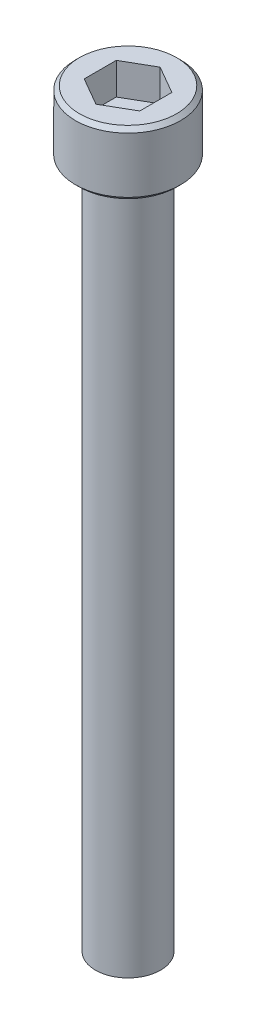
ISO-10303-21;
HEADER;
FILE_DESCRIPTION(('STEP AP214'),'2;1');
FILE_NAME('part.step','',(''),(''),'','','');
FILE_SCHEMA(('AUTOMOTIVE_DESIGN { 1 0 10303 214 1 1 1 1 }'));
ENDSEC;
DATA;
#1=APPLICATION_CONTEXT('core data for automotive mechanical design processes');
#2=APPLICATION_PROTOCOL_DEFINITION('international standard','automotive_design',2000,#1);
#3=PRODUCT_CONTEXT('',#1,'mechanical');
#4=PRODUCT('Part','Part','',(#3));
#5=PRODUCT_RELATED_PRODUCT_CATEGORY('part','',(#4));
#6=PRODUCT_DEFINITION_FORMATION('','',#4);
#7=PRODUCT_DEFINITION_CONTEXT('part definition',#1,'design');
#8=PRODUCT_DEFINITION('design','',#6,#7);
#9=PRODUCT_DEFINITION_SHAPE('','',#8);
#10=(LENGTH_UNIT() NAMED_UNIT(*) SI_UNIT(.MILLI.,.METRE.));
#11=(NAMED_UNIT(*) PLANE_ANGLE_UNIT() SI_UNIT($,.RADIAN.));
#12=(NAMED_UNIT(*) SI_UNIT($,.STERADIAN.) SOLID_ANGLE_UNIT());
#13=UNCERTAINTY_MEASURE_WITH_UNIT(LENGTH_MEASURE(1.E-05),#10,'distance_accuracy_value','');
#14=(GEOMETRIC_REPRESENTATION_CONTEXT(3) GLOBAL_UNCERTAINTY_ASSIGNED_CONTEXT((#13)) GLOBAL_UNIT_ASSIGNED_CONTEXT((#10,
#11,#12)) REPRESENTATION_CONTEXT('',''));
#15=CARTESIAN_POINT('',(0.,0.,0.));
#16=DIRECTION('',(0.,0.,1.));
#17=DIRECTION('',(1.,0.,0.));
#18=AXIS2_PLACEMENT_3D('',#15,#16,#17);
#19=CARTESIAN_POINT('',(0.,4.064,0.));
#20=DIRECTION('',(0.,-1.,0.));
#21=DIRECTION('',(1.,0.,0.));
#22=AXIS2_PLACEMENT_3D('',#19,#20,#21);
#23=CYLINDRICAL_SURFACE('',#22,3.3655);
#24=CARTESIAN_POINT('',(0.,3.80999999990233,0.));
#25=DIRECTION('',(0.,1.,0.));
#26=DIRECTION('',(-1.,0.,0.));
#27=AXIS2_PLACEMENT_3D('',#24,#25,#26);
#28=CIRCLE('',#27,3.3655);
#29=CARTESIAN_POINT('',(-3.3655,3.80999999990233,0.));
#30=VERTEX_POINT('',#29);
#31=EDGE_CURVE('E154',#30,#30,#28,.F.);
#32=ORIENTED_EDGE('',*,*,#31,.T.);
#33=EDGE_LOOP('',(#32));
#34=FACE_BOUND('',#33,.T.);
#35=CARTESIAN_POINT('',(0.,0.254000000097677,0.));
#36=DIRECTION('',(0.,-1.,0.));
#37=DIRECTION('',(1.,0.,0.));
#38=AXIS2_PLACEMENT_3D('',#35,#36,#37);
#39=CIRCLE('',#38,3.3655);
#40=CARTESIAN_POINT('',(3.3655,0.254000000097677,0.));
#41=VERTEX_POINT('',#40);
#42=EDGE_CURVE('E151',#41,#41,#39,.F.);
#43=ORIENTED_EDGE('',*,*,#42,.T.);
#44=EDGE_LOOP('',(#43));
#45=FACE_BOUND('',#44,.T.);
#46=ADVANCED_FACE('F40',(#34,#45),#23,.T.);
#47=CARTESIAN_POINT('',(3.3655,4.064,0.));
#48=DIRECTION('',(0.,1.,0.));
#49=DIRECTION('',(-1.,0.,0.));
#50=AXIS2_PLACEMENT_3D('',#47,#48,#49);
#51=PLANE('',#50);
#52=CARTESIAN_POINT('',(0.,4.064,0.));
#53=DIRECTION('',(0.,1.,0.));
#54=DIRECTION('',(-1.,0.,0.));
#55=AXIS2_PLACEMENT_3D('',#52,#53,#54);
#56=CIRCLE('',#55,3.11149999990232);
#57=CARTESIAN_POINT('',(-3.11149999990232,4.064,0.));
#58=VERTEX_POINT('',#57);
#59=EDGE_CURVE('E157',#58,#58,#56,.T.);
#60=ORIENTED_EDGE('',*,*,#59,.T.);
#61=EDGE_LOOP('',(#60));
#62=FACE_BOUND('',#61,.T.);
#63=DIRECTION('',(0.,0.,-1.));
#64=VECTOR('',#63,1.);
#65=CARTESIAN_POINT('',(1.77800000000001,4.064,1.02652877861916));
#66=LINE('',#65,#64);
#67=CARTESIAN_POINT('',(1.77800000000001,4.064,1.02652877861916));
#68=VERTEX_POINT('',#67);
#69=CARTESIAN_POINT('',(1.77800000000001,4.064,-1.02652877861913));
#70=VERTEX_POINT('',#69);
#71=EDGE_CURVE('E56',#68,#70,#66,.T.);
#72=ORIENTED_EDGE('',*,*,#71,.F.);
#73=DIRECTION('',(0.866025403784437,0.,-0.500000000000003));
#74=VECTOR('',#73,1.);
#75=CARTESIAN_POINT('',(0.,4.064,2.05305755723832));
#76=LINE('',#75,#74);
#77=CARTESIAN_POINT('',(0.,4.064,2.05305755723832));
#78=VERTEX_POINT('',#77);
#79=EDGE_CURVE('E139',#78,#68,#76,.T.);
#80=ORIENTED_EDGE('',*,*,#79,.F.);
#81=DIRECTION('',(0.866025403784441,0.,0.499999999999996));
#82=VECTOR('',#81,1.);
#83=CARTESIAN_POINT('',(-1.77799999999999,4.064,1.02652877861917));
#84=LINE('',#83,#82);
#85=CARTESIAN_POINT('',(-1.77799999999999,4.064,1.02652877861917));
#86=VERTEX_POINT('',#85);
#87=EDGE_CURVE('E137',#86,#78,#84,.T.);
#88=ORIENTED_EDGE('',*,*,#87,.F.);
#89=DIRECTION('',(0.,0.,1.));
#90=VECTOR('',#89,1.);
#91=CARTESIAN_POINT('',(-1.778,4.064,-1.02652877861914));
#92=LINE('',#91,#90);
#93=CARTESIAN_POINT('',(-1.778,4.064,-1.02652877861914));
#94=VERTEX_POINT('',#93);
#95=EDGE_CURVE('E104',#94,#86,#92,.T.);
#96=ORIENTED_EDGE('',*,*,#95,.F.);
#97=DIRECTION('',(-0.866025403784436,0.,0.500000000000004));
#98=VECTOR('',#97,1.);
#99=CARTESIAN_POINT('',(0.,4.064,-2.05305755723831));
#100=LINE('',#99,#98);
#101=CARTESIAN_POINT('',(0.,4.064,-2.05305755723831));
#102=VERTEX_POINT('',#101);
#103=EDGE_CURVE('E133',#102,#94,#100,.T.);
#104=ORIENTED_EDGE('',*,*,#103,.F.);
#105=DIRECTION('',(-0.866025403784434,0.,-0.500000000000008));
#106=VECTOR('',#105,1.);
#107=CARTESIAN_POINT('',(1.77800000000001,4.064,-1.02652877861913));
#108=LINE('',#107,#106);
#109=EDGE_CURVE('E130',#70,#102,#108,.T.);
#110=ORIENTED_EDGE('',*,*,#109,.F.);
#111=EDGE_LOOP('',(#72,#80,#88,#96,#104,#110));
#112=FACE_BOUND('',#111,.T.);
#113=ADVANCED_FACE('F177',(#62,#112),#51,.T.);
#114=CARTESIAN_POINT('',(0.,0.,0.));
#115=DIRECTION('',(0.,-1.,0.));
#116=DIRECTION('',(1.,0.,0.));
#117=AXIS2_PLACEMENT_3D('',#114,#115,#116);
#118=PLANE('',#117);
#119=CARTESIAN_POINT('',(0.,0.,0.));
#120=DIRECTION('',(0.,-1.,0.));
#121=DIRECTION('',(1.,0.,0.));
#122=AXIS2_PLACEMENT_3D('',#119,#120,#121);
#123=CIRCLE('',#122,3.11149999990232);
#124=CARTESIAN_POINT('',(3.11149999990232,0.,0.));
#125=VERTEX_POINT('',#124);
#126=EDGE_CURVE('E160',#125,#125,#123,.T.);
#127=ORIENTED_EDGE('',*,*,#126,.T.);
#128=EDGE_LOOP('',(#127));
#129=FACE_BOUND('',#128,.T.);
#130=CARTESIAN_POINT('',(0.,0.,0.));
#131=DIRECTION('',(0.,-1.,0.));
#132=DIRECTION('',(1.,0.,0.));
#133=AXIS2_PLACEMENT_3D('',#130,#131,#132);
#134=CIRCLE('',#133,2.0828);
#135=CARTESIAN_POINT('',(2.0828,0.,0.));
#136=VERTEX_POINT('',#135);
#137=EDGE_CURVE('E143',#136,#136,#134,.T.);
#138=ORIENTED_EDGE('',*,*,#137,.F.);
#139=EDGE_LOOP('',(#138));
#140=FACE_BOUND('',#139,.T.);
#141=ADVANCED_FACE('F183',(#129,#140),#118,.T.);
#142=CARTESIAN_POINT('',(0.,-44.45,0.));
#143=DIRECTION('',(0.,1.,0.));
#144=DIRECTION('',(-1.,0.,0.));
#145=AXIS2_PLACEMENT_3D('',#142,#143,#144);
#146=CYLINDRICAL_SURFACE('',#145,2.0828);
#147=CARTESIAN_POINT('',(0.,-43.9115200000046,0.));
#148=DIRECTION('',(0.,-1.,0.));
#149=DIRECTION('',(1.,0.,0.));
#150=AXIS2_PLACEMENT_3D('',#147,#148,#149);
#151=CIRCLE('',#150,2.0828);
#152=CARTESIAN_POINT('',(2.0828,-43.9115200000046,0.));
#153=VERTEX_POINT('',#152);
#154=EDGE_CURVE('E11',#153,#153,#151,.F.);
#155=ORIENTED_EDGE('',*,*,#154,.T.);
#156=EDGE_LOOP('',(#155));
#157=FACE_BOUND('',#156,.T.);
#158=ORIENTED_EDGE('',*,*,#137,.T.);
#159=EDGE_LOOP('',(#158));
#160=FACE_BOUND('',#159,.T.);
#161=ADVANCED_FACE('F222',(#157,#160),#146,.T.);
#162=CARTESIAN_POINT('',(0.,-44.45,0.));
#163=DIRECTION('',(0.,-1.,0.));
#164=DIRECTION('',(1.,0.,0.));
#165=AXIS2_PLACEMENT_3D('',#162,#163,#164);
#166=PLANE('',#165);
#167=CARTESIAN_POINT('',(0.,-44.45,0.));
#168=DIRECTION('',(0.,-1.,0.));
#169=DIRECTION('',(1.,0.,0.));
#170=AXIS2_PLACEMENT_3D('',#167,#168,#169);
#171=CIRCLE('',#170,1.31318000001919);
#172=CARTESIAN_POINT('',(1.31318000001919,-44.45,0.));
#173=VERTEX_POINT('',#172);
#174=EDGE_CURVE('E49',#173,#173,#171,.T.);
#175=ORIENTED_EDGE('',*,*,#174,.T.);
#176=EDGE_LOOP('',(#175));
#177=FACE_BOUND('',#176,.T.);
#178=ADVANCED_FACE('F165',(#177),#166,.T.);
#179=CARTESIAN_POINT('',(1.77800000000001,2.032,1.02652877861916));
#180=DIRECTION('',(1.,0.,0.));
#181=DIRECTION('',(0.,0.,-1.));
#182=AXIS2_PLACEMENT_3D('',#179,#180,#181);
#183=PLANE('',#182);
#184=ORIENTED_EDGE('',*,*,#71,.T.);
#185=DIRECTION('',(0.,1.,0.));
#186=VECTOR('',#185,1.);
#187=CARTESIAN_POINT('',(1.77800000000001,2.032,-1.02652877861913));
#188=LINE('',#187,#186);
#189=CARTESIAN_POINT('',(1.77800000000001,2.032,-1.02652877861913));
#190=VERTEX_POINT('',#189);
#191=EDGE_CURVE('E86',#190,#70,#188,.T.);
#192=ORIENTED_EDGE('',*,*,#191,.F.);
#193=DIRECTION('',(0.,0.,-1.));
#194=VECTOR('',#193,1.);
#195=CARTESIAN_POINT('',(1.77800000000001,2.032,1.02652877861916));
#196=LINE('',#195,#194);
#197=CARTESIAN_POINT('',(1.77800000000001,2.032,1.02652877861916));
#198=VERTEX_POINT('',#197);
#199=EDGE_CURVE('E141',#198,#190,#196,.T.);
#200=ORIENTED_EDGE('',*,*,#199,.F.);
#201=DIRECTION('',(0.,1.,0.));
#202=VECTOR('',#201,1.);
#203=CARTESIAN_POINT('',(1.77800000000001,2.032,1.02652877861916));
#204=LINE('',#203,#202);
#205=EDGE_CURVE('E64',#198,#68,#204,.T.);
#206=ORIENTED_EDGE('',*,*,#205,.T.);
#207=EDGE_LOOP('',(#184,#192,#200,#206));
#208=FACE_BOUND('',#207,.T.);
#209=ADVANCED_FACE('F213',(#208),#183,.F.);
#210=CARTESIAN_POINT('',(0.,2.032,2.05305755723832));
#211=DIRECTION('',(0.500000000000003,0.,0.866025403784437));
#212=DIRECTION('',(0.866025403784437,0.,-0.500000000000003));
#213=AXIS2_PLACEMENT_3D('',#210,#211,#212);
#214=PLANE('',#213);
#215=ORIENTED_EDGE('',*,*,#79,.T.);
#216=ORIENTED_EDGE('',*,*,#205,.F.);
#217=DIRECTION('',(0.866025403784437,0.,-0.500000000000003));
#218=VECTOR('',#217,1.);
#219=CARTESIAN_POINT('',(0.,2.032,2.05305755723832));
#220=LINE('',#219,#218);
#221=CARTESIAN_POINT('',(0.,2.032,2.05305755723832));
#222=VERTEX_POINT('',#221);
#223=EDGE_CURVE('E116',#222,#198,#220,.T.);
#224=ORIENTED_EDGE('',*,*,#223,.F.);
#225=DIRECTION('',(0.,1.,0.));
#226=VECTOR('',#225,1.);
#227=CARTESIAN_POINT('',(0.,2.032,2.05305755723832));
#228=LINE('',#227,#226);
#229=EDGE_CURVE('E108',#222,#78,#228,.T.);
#230=ORIENTED_EDGE('',*,*,#229,.T.);
#231=EDGE_LOOP('',(#215,#216,#224,#230));
#232=FACE_BOUND('',#231,.T.);
#233=ADVANCED_FACE('F215',(#232),#214,.F.);
#234=CARTESIAN_POINT('',(-1.77799999999999,2.032,1.02652877861917));
#235=DIRECTION('',(-0.499999999999996,0.,0.866025403784441));
#236=DIRECTION('',(0.866025403784441,0.,0.499999999999996));
#237=AXIS2_PLACEMENT_3D('',#234,#235,#236);
#238=PLANE('',#237);
#239=ORIENTED_EDGE('',*,*,#87,.T.);
#240=ORIENTED_EDGE('',*,*,#229,.F.);
#241=DIRECTION('',(0.866025403784441,0.,0.499999999999996));
#242=VECTOR('',#241,1.);
#243=CARTESIAN_POINT('',(-1.77799999999999,2.032,1.02652877861917));
#244=LINE('',#243,#242);
#245=CARTESIAN_POINT('',(-1.77799999999999,2.032,1.02652877861917));
#246=VERTEX_POINT('',#245);
#247=EDGE_CURVE('E112',#246,#222,#244,.T.);
#248=ORIENTED_EDGE('',*,*,#247,.F.);
#249=DIRECTION('',(0.,1.,0.));
#250=VECTOR('',#249,1.);
#251=CARTESIAN_POINT('',(-1.77799999999999,2.032,1.02652877861917));
#252=LINE('',#251,#250);
#253=EDGE_CURVE('E97',#246,#86,#252,.T.);
#254=ORIENTED_EDGE('',*,*,#253,.T.);
#255=EDGE_LOOP('',(#239,#240,#248,#254));
#256=FACE_BOUND('',#255,.T.);
#257=ADVANCED_FACE('F113',(#256),#238,.F.);
#258=CARTESIAN_POINT('',(-1.778,2.032,-1.02652877861914));
#259=DIRECTION('',(-1.,0.,0.));
#260=DIRECTION('',(0.,0.,1.));
#261=AXIS2_PLACEMENT_3D('',#258,#259,#260);
#262=PLANE('',#261);
#263=ORIENTED_EDGE('',*,*,#95,.T.);
#264=ORIENTED_EDGE('',*,*,#253,.F.);
#265=DIRECTION('',(0.,0.,1.));
#266=VECTOR('',#265,1.);
#267=CARTESIAN_POINT('',(-1.778,2.032,-1.02652877861914));
#268=LINE('',#267,#266);
#269=CARTESIAN_POINT('',(-1.778,2.032,-1.02652877861914));
#270=VERTEX_POINT('',#269);
#271=EDGE_CURVE('E101',#270,#246,#268,.T.);
#272=ORIENTED_EDGE('',*,*,#271,.F.);
#273=DIRECTION('',(0.,1.,0.));
#274=VECTOR('',#273,1.);
#275=CARTESIAN_POINT('',(-1.778,2.032,-1.02652877861914));
#276=LINE('',#275,#274);
#277=EDGE_CURVE('E109',#270,#94,#276,.T.);
#278=ORIENTED_EDGE('',*,*,#277,.T.);
#279=EDGE_LOOP('',(#263,#264,#272,#278));
#280=FACE_BOUND('',#279,.T.);
#281=ADVANCED_FACE('F99',(#280),#262,.F.);
#282=CARTESIAN_POINT('',(0.,2.032,-2.05305755723831));
#283=DIRECTION('',(-0.500000000000004,0.,-0.866025403784436));
#284=DIRECTION('',(-0.866025403784436,0.,0.500000000000004));
#285=AXIS2_PLACEMENT_3D('',#282,#283,#284);
#286=PLANE('',#285);
#287=ORIENTED_EDGE('',*,*,#103,.T.);
#288=ORIENTED_EDGE('',*,*,#277,.F.);
#289=DIRECTION('',(-0.866025403784436,0.,0.500000000000004));
#290=VECTOR('',#289,1.);
#291=CARTESIAN_POINT('',(0.,2.032,-2.05305755723831));
#292=LINE('',#291,#290);
#293=CARTESIAN_POINT('',(0.,2.032,-2.05305755723831));
#294=VERTEX_POINT('',#293);
#295=EDGE_CURVE('E122',#294,#270,#292,.T.);
#296=ORIENTED_EDGE('',*,*,#295,.F.);
#297=DIRECTION('',(0.,1.,0.));
#298=VECTOR('',#297,1.);
#299=CARTESIAN_POINT('',(0.,2.032,-2.05305755723831));
#300=LINE('',#299,#298);
#301=EDGE_CURVE('E146',#294,#102,#300,.T.);
#302=ORIENTED_EDGE('',*,*,#301,.T.);
#303=EDGE_LOOP('',(#287,#288,#296,#302));
#304=FACE_BOUND('',#303,.T.);
#305=ADVANCED_FACE('F277',(#304),#286,.F.);
#306=CARTESIAN_POINT('',(1.77800000000001,2.032,-1.02652877861913));
#307=DIRECTION('',(0.500000000000008,0.,-0.866025403784434));
#308=DIRECTION('',(-0.866025403784434,0.,-0.500000000000008));
#309=AXIS2_PLACEMENT_3D('',#306,#307,#308);
#310=PLANE('',#309);
#311=ORIENTED_EDGE('',*,*,#109,.T.);
#312=ORIENTED_EDGE('',*,*,#301,.F.);
#313=DIRECTION('',(-0.866025403784434,0.,-0.500000000000008));
#314=VECTOR('',#313,1.);
#315=CARTESIAN_POINT('',(1.77800000000001,2.032,-1.02652877861913));
#316=LINE('',#315,#314);
#317=EDGE_CURVE('E124',#190,#294,#316,.T.);
#318=ORIENTED_EDGE('',*,*,#317,.F.);
#319=ORIENTED_EDGE('',*,*,#191,.T.);
#320=EDGE_LOOP('',(#311,#312,#318,#319));
#321=FACE_BOUND('',#320,.T.);
#322=ADVANCED_FACE('F202',(#321),#310,.F.);
#323=CARTESIAN_POINT('',(0.,2.032,0.));
#324=DIRECTION('',(0.,1.,0.));
#325=DIRECTION('',(0.,0.,1.));
#326=AXIS2_PLACEMENT_3D('',#323,#324,#325);
#327=PLANE('',#326);
#328=ORIENTED_EDGE('',*,*,#199,.T.);
#329=ORIENTED_EDGE('',*,*,#317,.T.);
#330=ORIENTED_EDGE('',*,*,#295,.T.);
#331=ORIENTED_EDGE('',*,*,#271,.T.);
#332=ORIENTED_EDGE('',*,*,#247,.T.);
#333=ORIENTED_EDGE('',*,*,#223,.T.);
#334=EDGE_LOOP('',(#328,#329,#330,#331,#332,#333));
#335=FACE_BOUND('',#334,.T.);
#336=ADVANCED_FACE('F119',(#335),#327,.T.);
#337=CARTESIAN_POINT('',(0.,3.80999999990233,0.));
#338=DIRECTION('',(0.,-1.,0.));
#339=DIRECTION('',(1.,0.,0.));
#340=AXIS2_PLACEMENT_3D('',#337,#338,#339);
#341=CONICAL_SURFACE('',#340,3.3655,0.785398163397453);
#342=ORIENTED_EDGE('',*,*,#59,.F.);
#343=EDGE_LOOP('',(#342));
#344=FACE_BOUND('',#343,.T.);
#345=ORIENTED_EDGE('',*,*,#31,.F.);
#346=EDGE_LOOP('',(#345));
#347=FACE_BOUND('',#346,.T.);
#348=ADVANCED_FACE('F173',(#344,#347),#341,.T.);
#349=CARTESIAN_POINT('',(0.,0.,0.));
#350=DIRECTION('',(0.,1.,0.));
#351=DIRECTION('',(-1.,0.,0.));
#352=AXIS2_PLACEMENT_3D('',#349,#350,#351);
#353=CONICAL_SURFACE('',#352,3.11149999990232,0.785398163397444);
#354=ORIENTED_EDGE('',*,*,#42,.F.);
#355=EDGE_LOOP('',(#354));
#356=FACE_BOUND('',#355,.T.);
#357=ORIENTED_EDGE('',*,*,#126,.F.);
#358=EDGE_LOOP('',(#357));
#359=FACE_BOUND('',#358,.T.);
#360=ADVANCED_FACE('F168',(#356,#359),#353,.T.);
#361=CARTESIAN_POINT('',(0.,-44.45,0.));
#362=DIRECTION('',(0.,1.,0.));
#363=DIRECTION('',(-1.,0.,0.));
#364=AXIS2_PLACEMENT_3D('',#361,#362,#363);
#365=CONICAL_SURFACE('',#364,1.31318000001919,0.960291895402794);
#366=ORIENTED_EDGE('',*,*,#154,.F.);
#367=EDGE_LOOP('',(#366));
#368=FACE_BOUND('',#367,.T.);
#369=ORIENTED_EDGE('',*,*,#174,.F.);
#370=EDGE_LOOP('',(#369));
#371=FACE_BOUND('',#370,.T.);
#372=ADVANCED_FACE('F43',(#368,#371),#365,.T.);
#373=CLOSED_SHELL('',(#46,#113,#141,#161,#178,#209,#233,#257,#281,#305,#322,#336,#348,#360,#372));
#374=MANIFOLD_SOLID_BREP('B2',#373);
#375=ADVANCED_BREP_SHAPE_REPRESENTATION('',(#18,#374),#14);
#376=SHAPE_DEFINITION_REPRESENTATION(#9,#375);
ENDSEC;
END-ISO-10303-21;
